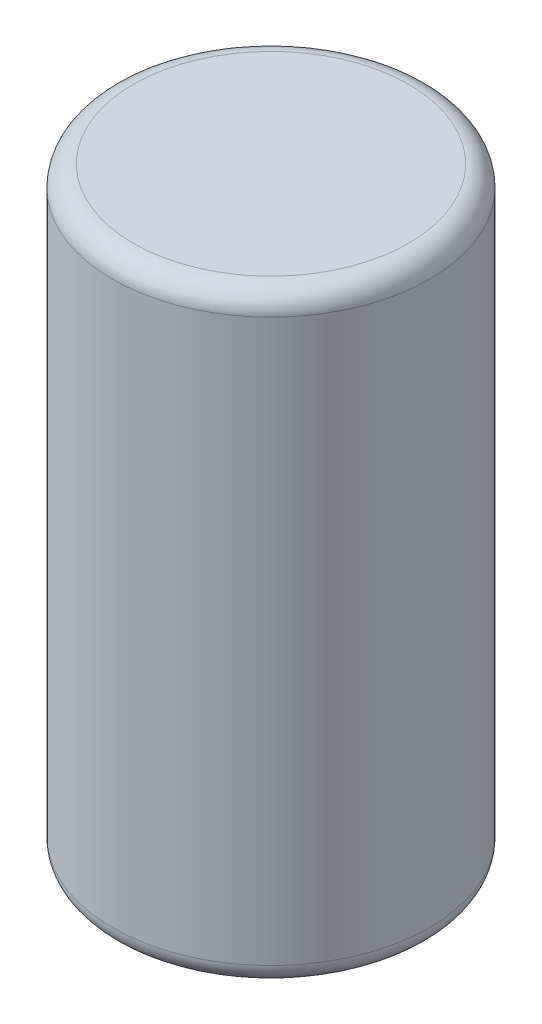
ISO-10303-21;
HEADER;
FILE_DESCRIPTION(('STEP AP214'),'2;1');
FILE_NAME('part.step','',(''),(''),'','','');
FILE_SCHEMA(('AUTOMOTIVE_DESIGN { 1 0 10303 214 1 1 1 1 }'));
ENDSEC;
DATA;
#1=APPLICATION_CONTEXT('core data for automotive mechanical design processes');
#2=APPLICATION_PROTOCOL_DEFINITION('international standard','automotive_design',2000,#1);
#3=PRODUCT_CONTEXT('',#1,'mechanical');
#4=PRODUCT('Part','Part','',(#3));
#5=PRODUCT_RELATED_PRODUCT_CATEGORY('part','',(#4));
#6=PRODUCT_DEFINITION_FORMATION('','',#4);
#7=PRODUCT_DEFINITION_CONTEXT('part definition',#1,'design');
#8=PRODUCT_DEFINITION('design','',#6,#7);
#9=PRODUCT_DEFINITION_SHAPE('','',#8);
#10=(LENGTH_UNIT() NAMED_UNIT(*) SI_UNIT(.MILLI.,.METRE.));
#11=(NAMED_UNIT(*) PLANE_ANGLE_UNIT() SI_UNIT($,.RADIAN.));
#12=(NAMED_UNIT(*) SI_UNIT($,.STERADIAN.) SOLID_ANGLE_UNIT());
#13=UNCERTAINTY_MEASURE_WITH_UNIT(LENGTH_MEASURE(1.E-05),#10,'distance_accuracy_value','');
#14=(GEOMETRIC_REPRESENTATION_CONTEXT(3) GLOBAL_UNCERTAINTY_ASSIGNED_CONTEXT((#13)) GLOBAL_UNIT_ASSIGNED_CONTEXT((#10,
#11,#12)) REPRESENTATION_CONTEXT('',''));
#15=CARTESIAN_POINT('',(0.,0.,0.));
#16=DIRECTION('',(0.,0.,1.));
#17=DIRECTION('',(1.,0.,0.));
#18=AXIS2_PLACEMENT_3D('',#15,#16,#17);
#19=CARTESIAN_POINT('',(0.,290.,0.));
#20=DIRECTION('',(0.,-1.,0.));
#21=DIRECTION('',(0.,0.,-1.));
#22=AXIS2_PLACEMENT_3D('',#19,#20,#21);
#23=CYLINDRICAL_SURFACE('',#22,76.2);
#24=CARTESIAN_POINT('',(0.,10.,0.));
#25=DIRECTION('',(0.,1.,0.));
#26=DIRECTION('',(0.,0.,1.));
#27=AXIS2_PLACEMENT_3D('',#24,#25,#26);
#28=CIRCLE('',#27,76.2);
#29=CARTESIAN_POINT('',(0.,10.,76.2));
#30=VERTEX_POINT('',#29);
#31=EDGE_CURVE('E42',#30,#30,#28,.T.);
#32=ORIENTED_EDGE('',*,*,#31,.T.);
#33=EDGE_LOOP('',(#32));
#34=FACE_BOUND('',#33,.T.);
#35=CARTESIAN_POINT('',(0.,280.,0.));
#36=DIRECTION('',(0.,1.,0.));
#37=DIRECTION('',(0.,0.,1.));
#38=AXIS2_PLACEMENT_3D('',#35,#36,#37);
#39=CIRCLE('',#38,76.2);
#40=CARTESIAN_POINT('',(0.,280.,76.2));
#41=VERTEX_POINT('',#40);
#42=EDGE_CURVE('E46',#41,#41,#39,.F.);
#43=ORIENTED_EDGE('',*,*,#42,.T.);
#44=EDGE_LOOP('',(#43));
#45=FACE_BOUND('',#44,.T.);
#46=ADVANCED_FACE('F31',(#34,#45),#23,.T.);
#47=CARTESIAN_POINT('',(0.,290.,0.));
#48=DIRECTION('',(0.,1.,0.));
#49=DIRECTION('',(0.,0.,1.));
#50=AXIS2_PLACEMENT_3D('',#47,#48,#49);
#51=PLANE('',#50);
#52=CARTESIAN_POINT('',(0.,290.,0.));
#53=DIRECTION('',(0.,1.,0.));
#54=DIRECTION('',(0.,0.,1.));
#55=AXIS2_PLACEMENT_3D('',#52,#53,#54);
#56=CIRCLE('',#55,66.2);
#57=CARTESIAN_POINT('',(0.,290.,66.2));
#58=VERTEX_POINT('',#57);
#59=EDGE_CURVE('E10',#58,#58,#56,.T.);
#60=ORIENTED_EDGE('',*,*,#59,.T.);
#61=EDGE_LOOP('',(#60));
#62=FACE_BOUND('',#61,.T.);
#63=ADVANCED_FACE('F62',(#62),#51,.T.);
#64=CARTESIAN_POINT('',(0.,0.,0.));
#65=DIRECTION('',(0.,1.,0.));
#66=DIRECTION('',(0.,0.,1.));
#67=AXIS2_PLACEMENT_3D('',#64,#65,#66);
#68=PLANE('',#67);
#69=CARTESIAN_POINT('',(0.,0.,0.));
#70=DIRECTION('',(0.,1.,0.));
#71=DIRECTION('',(0.,0.,1.));
#72=AXIS2_PLACEMENT_3D('',#69,#70,#71);
#73=CIRCLE('',#72,66.2);
#74=CARTESIAN_POINT('',(0.,0.,66.2));
#75=VERTEX_POINT('',#74);
#76=EDGE_CURVE('E38',#75,#75,#73,.F.);
#77=ORIENTED_EDGE('',*,*,#76,.T.);
#78=EDGE_LOOP('',(#77));
#79=FACE_BOUND('',#78,.T.);
#80=ADVANCED_FACE('F59',(#79),#68,.F.);
#81=CARTESIAN_POINT('',(0.,10.,0.));
#82=DIRECTION('',(0.,1.,0.));
#83=DIRECTION('',(0.,0.,1.));
#84=AXIS2_PLACEMENT_3D('',#81,#82,#83);
#85=TOROIDAL_SURFACE('',#84,66.2,10.);
#86=ORIENTED_EDGE('',*,*,#76,.F.);
#87=EDGE_LOOP('',(#86));
#88=FACE_BOUND('',#87,.T.);
#89=ORIENTED_EDGE('',*,*,#31,.F.);
#90=EDGE_LOOP('',(#89));
#91=FACE_BOUND('',#90,.T.);
#92=ADVANCED_FACE('F55',(#88,#91),#85,.T.);
#93=CARTESIAN_POINT('',(0.,280.,0.));
#94=DIRECTION('',(0.,1.,0.));
#95=DIRECTION('',(0.,0.,1.));
#96=AXIS2_PLACEMENT_3D('',#93,#94,#95);
#97=TOROIDAL_SURFACE('',#96,66.2,10.);
#98=ORIENTED_EDGE('',*,*,#42,.F.);
#99=EDGE_LOOP('',(#98));
#100=FACE_BOUND('',#99,.T.);
#101=ORIENTED_EDGE('',*,*,#59,.F.);
#102=EDGE_LOOP('',(#101));
#103=FACE_BOUND('',#102,.T.);
#104=ADVANCED_FACE('F33',(#100,#103),#97,.T.);
#105=CLOSED_SHELL('',(#46,#63,#80,#92,#104));
#106=MANIFOLD_SOLID_BREP('B2',#105);
#107=ADVANCED_BREP_SHAPE_REPRESENTATION('',(#18,#106),#14);
#108=SHAPE_DEFINITION_REPRESENTATION(#9,#107);
ENDSEC;
END-ISO-10303-21;
